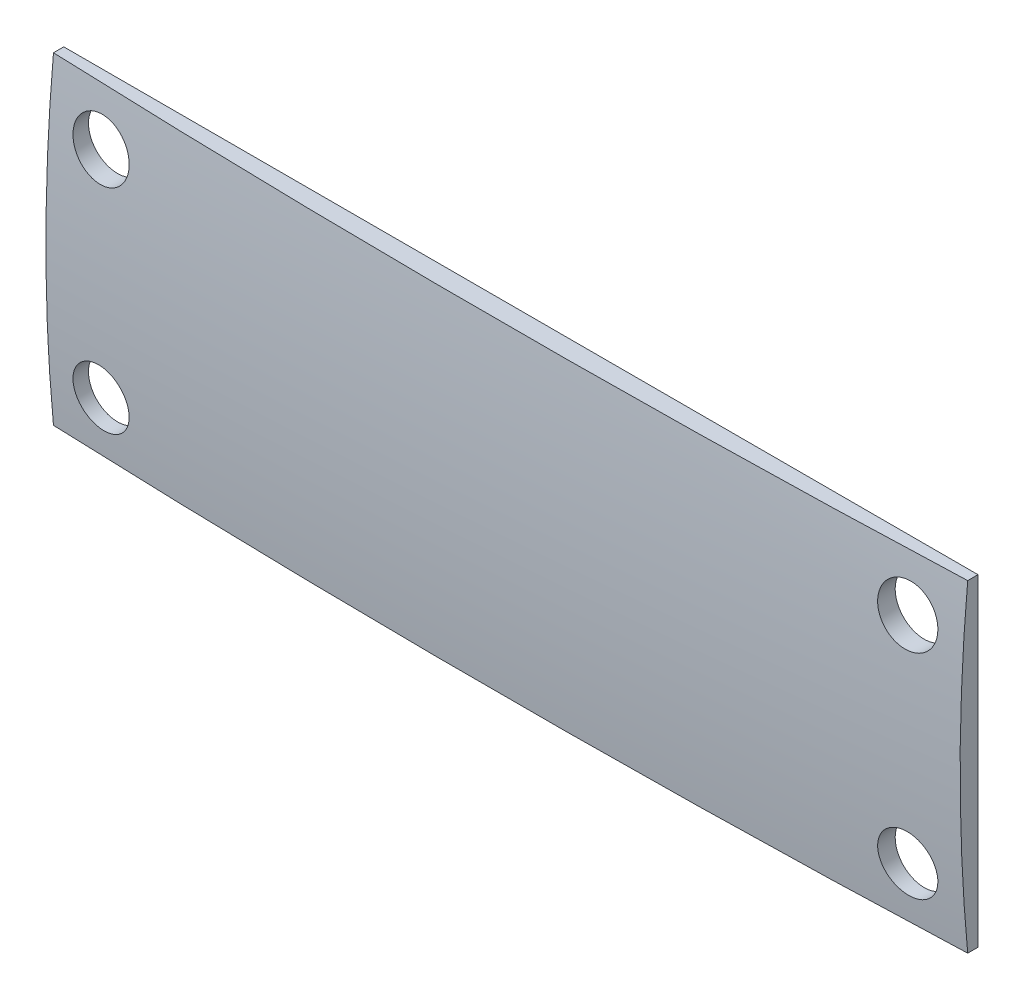
ISO-10303-21;
HEADER;
FILE_DESCRIPTION(('STEP AP214'),'2;1');
FILE_NAME('part.step','',(''),(''),'','','');
FILE_SCHEMA(('AUTOMOTIVE_DESIGN { 1 0 10303 214 1 1 1 1 }'));
ENDSEC;
DATA;
#1=APPLICATION_CONTEXT('core data for automotive mechanical design processes');
#2=APPLICATION_PROTOCOL_DEFINITION('international standard','automotive_design',2000,#1);
#3=PRODUCT_CONTEXT('',#1,'mechanical');
#4=PRODUCT('Part','Part','',(#3));
#5=PRODUCT_RELATED_PRODUCT_CATEGORY('part','',(#4));
#6=PRODUCT_DEFINITION_FORMATION('','',#4);
#7=PRODUCT_DEFINITION_CONTEXT('part definition',#1,'design');
#8=PRODUCT_DEFINITION('design','',#6,#7);
#9=PRODUCT_DEFINITION_SHAPE('','',#8);
#10=(LENGTH_UNIT() NAMED_UNIT(*) SI_UNIT(.MILLI.,.METRE.));
#11=(NAMED_UNIT(*) PLANE_ANGLE_UNIT() SI_UNIT($,.RADIAN.));
#12=(NAMED_UNIT(*) SI_UNIT($,.STERADIAN.) SOLID_ANGLE_UNIT());
#13=UNCERTAINTY_MEASURE_WITH_UNIT(LENGTH_MEASURE(1.E-05),#10,'distance_accuracy_value','');
#14=(GEOMETRIC_REPRESENTATION_CONTEXT(3) GLOBAL_UNCERTAINTY_ASSIGNED_CONTEXT((#13)) GLOBAL_UNIT_ASSIGNED_CONTEXT((#10,
#11,#12)) REPRESENTATION_CONTEXT('',''));
#15=CARTESIAN_POINT('',(0.,0.,0.));
#16=DIRECTION('',(0.,0.,1.));
#17=DIRECTION('',(1.,0.,0.));
#18=AXIS2_PLACEMENT_3D('',#15,#16,#17);
#19=CARTESIAN_POINT('',(53.975,19.05,-2745.74));
#20=DIRECTION('',(1.,0.,0.));
#21=DIRECTION('',(0.,0.,-1.));
#22=AXIS2_PLACEMENT_3D('',#19,#20,#21);
#23=PLANE('',#22);
#24=DIRECTION('',(0.,0.,1.));
#25=VECTOR('',#24,1.);
#26=CARTESIAN_POINT('',(53.975,-19.05,-2745.74));
#27=LINE('',#26,#25);
#28=CARTESIAN_POINT('',(53.975,-19.05,-3.175));
#29=VERTEX_POINT('',#28);
#30=CARTESIAN_POINT('',(53.975,-19.05,-1.95920329500043));
#31=VERTEX_POINT('',#30);
#32=EDGE_CURVE('E96',#29,#31,#27,.T.);
#33=ORIENTED_EDGE('',*,*,#32,.F.);
#34=DIRECTION('',(0.,1.,0.));
#35=VECTOR('',#34,1.);
#36=CARTESIAN_POINT('',(53.975,22.3762154077602,-3.175));
#37=LINE('',#36,#35);
#38=CARTESIAN_POINT('',(53.975,19.05,-3.175));
#39=VERTEX_POINT('',#38);
#40=EDGE_CURVE('E80',#29,#39,#37,.T.);
#41=ORIENTED_EDGE('',*,*,#40,.T.);
#42=DIRECTION('',(0.,0.,1.));
#43=VECTOR('',#42,1.);
#44=CARTESIAN_POINT('',(53.975,19.05,-2745.74));
#45=LINE('',#44,#43);
#46=CARTESIAN_POINT('',(53.975,19.05,-1.95920329500043));
#47=VERTEX_POINT('',#46);
#48=EDGE_CURVE('E84',#39,#47,#45,.T.);
#49=ORIENTED_EDGE('',*,*,#48,.T.);
#50=CARTESIAN_POINT('',(53.9749999999998,19.05,-1.95920329500056));
#51=CARTESIAN_POINT('',(53.9749999999999,17.9924033348274,-1.8594856106786));
#52=CARTESIAN_POINT('',(53.975,16.9340283265598,-1.76801425342624));
#53=CARTESIAN_POINT('',(53.975,14.8172760570648,-1.60173450307606));
#54=CARTESIAN_POINT('',(53.975,13.7589003898154,-1.52690581615503));
#55=CARTESIAN_POINT('',(53.975,11.6421470904961,-1.39390225706191));
#56=CARTESIAN_POINT('',(53.975,10.5837704825943,-1.33571109014283));
#57=CARTESIAN_POINT('',(53.975,8.46701633278184,-1.23597144435434));
#58=CARTESIAN_POINT('',(53.975,7.40863936838826,-1.19441071075106));
#59=CARTESIAN_POINT('',(53.975,5.29188507272644,-1.12792356554718));
#60=CARTESIAN_POINT('',(53.975,4.23350799868107,-1.1029889664348));
#61=CARTESIAN_POINT('',(53.975,2.11675390681585,-1.06974723204027));
#62=CARTESIAN_POINT('',(53.975,1.05837695340797,-1.06143599589672));
#63=CARTESIAN_POINT('',(53.975,-1.05837695340781,-1.06143599589672));
#64=CARTESIAN_POINT('',(53.975,-2.11675390681569,-1.06974723204027));
#65=CARTESIAN_POINT('',(53.975,-4.23350799868091,-1.10298896643479));
#66=CARTESIAN_POINT('',(53.975,-5.29188507272628,-1.12792356554715));
#67=CARTESIAN_POINT('',(53.975,-7.4086393683881,-1.19441071075107));
#68=CARTESIAN_POINT('',(53.975,-8.46701633278168,-1.23597144435441));
#69=CARTESIAN_POINT('',(53.975,-10.5837704825942,-1.33571109014279));
#70=CARTESIAN_POINT('',(53.975,-11.642147090496,-1.3939022570617));
#71=CARTESIAN_POINT('',(53.975,-13.7589003898153,-1.52690581615482));
#72=CARTESIAN_POINT('',(53.975,-14.8172760570647,-1.60173450307599));
#73=CARTESIAN_POINT('',(53.9749999999999,-16.9340283265597,-1.76801425342634));
#74=CARTESIAN_POINT('',(53.9749999999998,-17.9924033348272,-1.85948561067874));
#75=CARTESIAN_POINT('',(53.9749999999995,-19.0499999999998,-1.95920329500047));
#76=B_SPLINE_CURVE_WITH_KNOTS('',3,(#50,#51,#52,#53,#54,#55,#56,#57,#58,#59,#60,#61,#62,#63,#64,
#65,#66,#67,#68,#69,#70,#71,#72,#73,#74,#75),.UNSPECIFIED.,.F.,.F.,(4,2,2,2,2,2,2,2,2,2,2,2,4),
(0.,3.18683083113672,6.36975411961527,9.54954929769601,12.7269969949887,15.9028788056506,
19.0779770529453,22.25307530024,25.428957110902,28.6064048081946,31.7861999862754,
34.9691232747539,38.1559541058906),.UNSPECIFIED.);
#77=EDGE_CURVE('E45',#47,#31,#76,.T.);
#78=ORIENTED_EDGE('',*,*,#77,.T.);
#79=EDGE_LOOP('',(#33,#41,#49,#78));
#80=FACE_BOUND('',#79,.T.);
#81=ADVANCED_FACE('F34',(#80),#23,.T.);
#82=CARTESIAN_POINT('',(-53.975,-19.05,-2745.74));
#83=DIRECTION('',(0.,-1.,0.));
#84=DIRECTION('',(0.,0.,-1.));
#85=AXIS2_PLACEMENT_3D('',#82,#83,#84);
#86=PLANE('',#85);
#87=DIRECTION('',(0.,0.,1.));
#88=VECTOR('',#87,1.);
#89=CARTESIAN_POINT('',(-53.975,-19.05,-2745.74));
#90=LINE('',#89,#88);
#91=CARTESIAN_POINT('',(-53.975,-19.05,-3.175));
#92=VERTEX_POINT('',#91);
#93=CARTESIAN_POINT('',(-53.975,-19.05,-1.95920329500066));
#94=VERTEX_POINT('',#93);
#95=EDGE_CURVE('E88',#92,#94,#90,.T.);
#96=ORIENTED_EDGE('',*,*,#95,.F.);
#97=DIRECTION('',(1.,0.,0.));
#98=VECTOR('',#97,1.);
#99=CARTESIAN_POINT('',(-53.975,-19.05,-3.17500000000015));
#100=LINE('',#99,#98);
#101=EDGE_CURVE('E77',#92,#29,#100,.T.);
#102=ORIENTED_EDGE('',*,*,#101,.T.);
#103=ORIENTED_EDGE('',*,*,#32,.T.);
#104=CARTESIAN_POINT('',(0.,-19.05,-1372.87));
#105=DIRECTION('',(0.,-1.,0.));
#106=DIRECTION('',(0.,0.,-1.));
#107=AXIS2_PLACEMENT_3D('',#104,#105,#106);
#108=CIRCLE('',#107,1371.97292726472);
#109=EDGE_CURVE('E94',#31,#94,#108,.T.);
#110=ORIENTED_EDGE('',*,*,#109,.T.);
#111=EDGE_LOOP('',(#96,#102,#103,#110));
#112=FACE_BOUND('',#111,.T.);
#113=ADVANCED_FACE('F92',(#112),#86,.T.);
#114=CARTESIAN_POINT('',(-53.975,19.05,-2745.74));
#115=DIRECTION('',(-1.,0.,0.));
#116=DIRECTION('',(0.,0.,1.));
#117=AXIS2_PLACEMENT_3D('',#114,#115,#116);
#118=PLANE('',#117);
#119=DIRECTION('',(0.,0.,1.));
#120=VECTOR('',#119,1.);
#121=CARTESIAN_POINT('',(-53.975,19.05,-2745.74));
#122=LINE('',#121,#120);
#123=CARTESIAN_POINT('',(-53.975,19.05,-3.17500000000015));
#124=VERTEX_POINT('',#123);
#125=CARTESIAN_POINT('',(-53.975,19.05,-1.95920329500043));
#126=VERTEX_POINT('',#125);
#127=EDGE_CURVE('E59',#124,#126,#122,.T.);
#128=ORIENTED_EDGE('',*,*,#127,.F.);
#129=DIRECTION('',(0.,-1.,0.));
#130=VECTOR('',#129,1.);
#131=CARTESIAN_POINT('',(-53.975,22.3762154077602,-3.175));
#132=LINE('',#131,#130);
#133=EDGE_CURVE('E53',#124,#92,#132,.T.);
#134=ORIENTED_EDGE('',*,*,#133,.T.);
#135=ORIENTED_EDGE('',*,*,#95,.T.);
#136=CARTESIAN_POINT('',(-53.975,-19.0499999999999,-1.95920329500056));
#137=CARTESIAN_POINT('',(-53.975,-17.9924033348273,-1.85948561067876));
#138=CARTESIAN_POINT('',(-53.975,-16.9340283265597,-1.76801425342634));
#139=CARTESIAN_POINT('',(-53.975,-14.8172760570647,-1.60173450307597));
#140=CARTESIAN_POINT('',(-53.975,-13.7589003898153,-1.52690581615481));
#141=CARTESIAN_POINT('',(-53.975,-11.642147090496,-1.3939022570617));
#142=CARTESIAN_POINT('',(-53.975,-10.5837704825943,-1.33571109014279));
#143=CARTESIAN_POINT('',(-53.975,-8.46701633278176,-1.2359714443544));
#144=CARTESIAN_POINT('',(-53.975,-7.40863936838817,-1.19441071075106));
#145=CARTESIAN_POINT('',(-53.975,-5.29188507272635,-1.12792356554715));
#146=CARTESIAN_POINT('',(-53.975,-4.23350799868098,-1.10298896643479));
#147=CARTESIAN_POINT('',(-53.975,-2.11675390681576,-1.06974723204027));
#148=CARTESIAN_POINT('',(-53.975,-1.05837695340787,-1.06143599589672));
#149=CARTESIAN_POINT('',(-53.975,1.05837695340791,-1.06143599589672));
#150=CARTESIAN_POINT('',(-53.975,2.11675390681579,-1.06974723204027));
#151=CARTESIAN_POINT('',(-53.975,4.23350799868101,-1.1029889664348));
#152=CARTESIAN_POINT('',(-53.975,5.29188507272639,-1.12792356554717));
#153=CARTESIAN_POINT('',(-53.975,7.40863936838821,-1.19441071075106));
#154=CARTESIAN_POINT('',(-53.975,8.46701633278179,-1.23597144435436));
#155=CARTESIAN_POINT('',(-53.975,10.5837704825943,-1.33571109014285));
#156=CARTESIAN_POINT('',(-53.975,11.6421470904961,-1.39390225706191));
#157=CARTESIAN_POINT('',(-53.975,13.7589003898154,-1.52690581615502));
#158=CARTESIAN_POINT('',(-53.975,14.8172760570648,-1.60173450307605));
#159=CARTESIAN_POINT('',(-53.975,16.9340283265598,-1.76801425342622));
#160=CARTESIAN_POINT('',(-53.975,17.9924033348274,-1.85948561067856));
#161=CARTESIAN_POINT('',(-53.975,19.0499999999999,-1.95920329500047));
#162=B_SPLINE_CURVE_WITH_KNOTS('',3,(#136,#137,#138,#139,#140,#141,#142,#143,#144,#145,#146,
#147,#148,#149,#150,#151,#152,#153,#154,#155,#156,#157,#158,#159,#160,#161),.UNSPECIFIED.,.F.,
.F.,(4,2,2,2,2,2,2,2,2,2,2,2,4),(0.,3.18683083113672,6.36975411961529,9.54954929769603,
12.7269969949887,15.9028788056507,19.0779770529454,22.25307530024,25.428957110902,
28.6064048081947,31.7861999862754,34.969123274754,38.1559541058907),.UNSPECIFIED.);
#163=EDGE_CURVE('E105',#94,#126,#162,.T.);
#164=ORIENTED_EDGE('',*,*,#163,.T.);
#165=EDGE_LOOP('',(#128,#134,#135,#164));
#166=FACE_BOUND('',#165,.T.);
#167=ADVANCED_FACE('F87',(#166),#118,.T.);
#168=CARTESIAN_POINT('',(-53.975,19.05,-2745.74));
#169=DIRECTION('',(0.,1.,0.));
#170=DIRECTION('',(0.,0.,1.));
#171=AXIS2_PLACEMENT_3D('',#168,#169,#170);
#172=PLANE('',#171);
#173=ORIENTED_EDGE('',*,*,#48,.F.);
#174=DIRECTION('',(-1.,0.,0.));
#175=VECTOR('',#174,1.);
#176=CARTESIAN_POINT('',(-53.975,19.05,-3.17500000000015));
#177=LINE('',#176,#175);
#178=EDGE_CURVE('E12',#39,#124,#177,.T.);
#179=ORIENTED_EDGE('',*,*,#178,.T.);
#180=ORIENTED_EDGE('',*,*,#127,.T.);
#181=CARTESIAN_POINT('',(0.,19.05,-1372.87));
#182=DIRECTION('',(0.,-1.,0.));
#183=DIRECTION('',(0.,0.,-1.));
#184=AXIS2_PLACEMENT_3D('',#181,#182,#183);
#185=CIRCLE('',#184,1371.97292726472);
#186=EDGE_CURVE('E98',#126,#47,#185,.F.);
#187=ORIENTED_EDGE('',*,*,#186,.T.);
#188=EDGE_LOOP('',(#173,#179,#180,#187));
#189=FACE_BOUND('',#188,.T.);
#190=ADVANCED_FACE('F117',(#189),#172,.T.);
#191=CARTESIAN_POINT('',(0.,1.95086345019787E-13,-1372.87));
#192=DIRECTION('',(1.,0.,0.));
#193=DIRECTION('',(0.,0.,1.));
#194=AXIS2_PLACEMENT_3D('',#191,#192,#193);
#195=ELLIPSE('',#194,1372.87,527.05);
#196=TRIMMED_CURVE('',#195,(PARAMETER_VALUE(4.71238898038469)),
(PARAMETER_VALUE(7.85398163397448)),.T.,.PARAMETER.);
#197=CARTESIAN_POINT('',(0.,-527.05,-1372.87));
#198=DIRECTION('',(0.,-1.,0.));
#199=AXIS1_PLACEMENT('',#197,#198);
#200=SURFACE_OF_REVOLUTION('',#196,#199);
#201=CARTESIAN_POINT('',(-51.054,-12.6999999999999,-1.34852372931991));
#202=CARTESIAN_POINT('',(-51.0539914256195,-12.5069583414921,-1.33639526311172));
#203=CARTESIAN_POINT('',(-51.0376441534456,-12.3137964700659,-1.32392969212028));
#204=CARTESIAN_POINT('',(-50.9726742623735,-11.9328349545905,-1.2986652675942));
#205=CARTESIAN_POINT('',(-50.9240123789474,-11.7450421242065,-1.28586602682669));
#206=CARTESIAN_POINT('',(-50.7958050544153,-11.3803971699149,-1.26025473595436));
#207=CARTESIAN_POINT('',(-50.7162747523711,-11.2035397320855,-1.24744269519464));
#208=CARTESIAN_POINT('',(-50.528606605591,-10.8657604160385,-1.22207857056183));
#209=CARTESIAN_POINT('',(-50.4204759834359,-10.7048345286283,-1.20952642191862));
#210=CARTESIAN_POINT('',(-50.1786431544214,-10.4034189214012,-1.18492222261351));
#211=CARTESIAN_POINT('',(-50.044937132299,-10.2629322561594,-1.17287024689278));
#212=CARTESIAN_POINT('',(-49.7557485899998,-10.0064319687207,-1.14949135253923));
#213=CARTESIAN_POINT('',(-49.6002652541209,-9.890419263641,-1.13816446108869));
#214=CARTESIAN_POINT('',(-49.272079323622,-9.68628409385795,-1.11645339063856));
#215=CARTESIAN_POINT('',(-49.0993913063042,-9.59813827779926,-1.10606842757226));
#216=CARTESIAN_POINT('',(-48.7415918638466,-9.452139664346,-1.08642988631453));
#217=CARTESIAN_POINT('',(-48.5564805431451,-9.3942866123272,-1.07717629861388));
#218=CARTESIAN_POINT('',(-48.1793662207213,-9.31060894741609,-1.06000892606623));
#219=CARTESIAN_POINT('',(-47.987373182274,-9.28473981411479,-1.05209329212676));
#220=CARTESIAN_POINT('',(-47.6017143356272,-9.26564825124079,-1.0377810400601));
#221=CARTESIAN_POINT('',(-47.4080485446906,-9.27242548515665,-1.03138440627612));
#222=CARTESIAN_POINT('',(-47.0248861489523,-9.31842123507302,-1.02031136973446));
#223=CARTESIAN_POINT('',(-46.8353831307718,-9.35758563860736,-1.01563211639372));
#224=CARTESIAN_POINT('',(-46.4656101070955,-9.46719294754072,-1.00816049199849));
#225=CARTESIAN_POINT('',(-46.2853400241729,-9.53763559059424,-1.00536810511845));
#226=CARTESIAN_POINT('',(-45.9394480329413,-9.70767052653722,-1.00183430141488));
#227=CARTESIAN_POINT('',(-45.7738034642329,-9.80721665741293,-1.00108965591636));
#228=CARTESIAN_POINT('',(-45.4615560023601,-10.0326731469582,-1.00176843327446));
#229=CARTESIAN_POINT('',(-45.314952959163,-10.1585832978792,-1.00319183904737));
#230=CARTESIAN_POINT('',(-45.0450788393149,-10.4330515933519,-1.00828073929791));
#231=CARTESIAN_POINT('',(-44.9217862733432,-10.5815886483433,-1.01194415544364));
#232=CARTESIAN_POINT('',(-44.7018483743063,-10.8971644935936,-1.02152219874353));
#233=CARTESIAN_POINT('',(-44.6052030185147,-11.0642032680731,-1.02743682397771));
#234=CARTESIAN_POINT('',(-44.4412390530316,-11.4120947919298,-1.04145254312957));
#235=CARTESIAN_POINT('',(-44.3739317418318,-11.5929528318416,-1.04955447746889));
#236=CARTESIAN_POINT('',(-44.270561579903,-11.963288636405,-1.06778884141748));
#237=CARTESIAN_POINT('',(-44.2344990025966,-12.1527664764731,-1.07792128879482));
#238=CARTESIAN_POINT('',(-44.1945477416304,-12.5353621670769,-1.09999305635925));
#239=CARTESIAN_POINT('',(-44.1907232316773,-12.7284865113149,-1.11193593236269));
#240=CARTESIAN_POINT('',(-44.215472982554,-13.1125506095234,-1.13727855968163));
#241=CARTESIAN_POINT('',(-44.2440477829416,-13.3034903270589,-1.15067833525605));
#242=CARTESIAN_POINT('',(-44.3328809500352,-13.6783706614416,-1.17856254505023));
#243=CARTESIAN_POINT('',(-44.3932330060058,-13.8622888476972,-1.19305007744089));
#244=CARTESIAN_POINT('',(-44.5439432387531,-14.217341767763,-1.22259414565668));
#245=CARTESIAN_POINT('',(-44.634301891724,-14.3884762986483,-1.23765069050848));
#246=CARTESIAN_POINT('',(-44.8427161315602,-14.7135290096139,-1.26784558757211));
#247=CARTESIAN_POINT('',(-44.9608369945054,-14.8674053318915,-1.28298404915021));
#248=CARTESIAN_POINT('',(-45.2213220108912,-15.1531088876971,-1.31276229216788));
#249=CARTESIAN_POINT('',(-45.3636862910754,-15.2849360059455,-1.32740207099989));
#250=CARTESIAN_POINT('',(-45.6686710835796,-15.5228042509417,-1.35564985113703));
#251=CARTESIAN_POINT('',(-45.8312953722145,-15.6288405595674,-1.36925765932781));
#252=CARTESIAN_POINT('',(-46.1721785114313,-15.8120395233231,-1.39493912545389));
#253=CARTESIAN_POINT('',(-46.3504371747818,-15.8892025241708,-1.40701280175714));
#254=CARTESIAN_POINT('',(-46.7170878358495,-16.0122563220818,-1.4291640447967));
#255=CARTESIAN_POINT('',(-46.9054548867127,-16.0582206026082,-1.4392462620592));
#256=CARTESIAN_POINT('',(-47.2873445138688,-16.1178026332334,-1.45710322276113));
#257=CARTESIAN_POINT('',(-47.4808669952265,-16.1314209785539,-1.46487800865901));
#258=CARTESIAN_POINT('',(-47.8668399008788,-16.1258829980867,-1.47785375247128));
#259=CARTESIAN_POINT('',(-48.0592916913805,-16.1068429294476,-1.4830637555583));
#260=CARTESIAN_POINT('',(-48.4383211633162,-16.0367189012797,-1.49082300268579));
#261=CARTESIAN_POINT('',(-48.6248989298762,-15.9856354063472,-1.4933722853025));
#262=CARTESIAN_POINT('',(-48.9863812118843,-15.8530383957957,-1.49579348254095));
#263=CARTESIAN_POINT('',(-49.1613144424356,-15.7716032714208,-1.49567224802603));
#264=CARTESIAN_POINT('',(-49.4950538448851,-15.5806080060186,-1.49286341248769));
#265=CARTESIAN_POINT('',(-49.6538607165627,-15.4710490861099,-1.49017592287577));
#266=CARTESIAN_POINT('',(-49.9508056132092,-15.2269736732978,-1.48242445510444));
#267=CARTESIAN_POINT('',(-50.0889509706271,-15.0924660724355,-1.47736132267526));
#268=CARTESIAN_POINT('',(-50.3407865488154,-14.8022511855676,-1.465120407982));
#269=CARTESIAN_POINT('',(-50.4544704914615,-14.6465384738862,-1.45794208396259));
#270=CARTESIAN_POINT('',(-50.6543894215619,-14.3179986342238,-1.44177124184082));
#271=CARTESIAN_POINT('',(-50.7405600582164,-14.1451326053145,-1.43277454979533));
#272=CARTESIAN_POINT('',(-50.8826138719608,-13.7876165333009,-1.41333487589191));
#273=CARTESIAN_POINT('',(-50.9385328139026,-13.6029806950567,-1.40289362028737));
#274=CARTESIAN_POINT('',(-51.0036565357482,-13.2976518596766,-1.38504962038776));
#275=CARTESIAN_POINT('',(-51.0225133817621,-13.1789114649602,-1.3779735979072));
#276=CARTESIAN_POINT('',(-51.0476877891476,-12.9401295549559,-1.36348311218256));
#277=CARTESIAN_POINT('',(-51.0540053339809,-12.820088037952,-1.35606864849213));
#278=CARTESIAN_POINT('',(-51.054,-12.6999999999999,-1.34852372931991));
#279=B_SPLINE_CURVE_WITH_KNOTS('',3,(#201,#202,#203,#204,#205,#206,#207,#208,#209,#210,#211,
#212,#213,#214,#215,#216,#217,#218,#219,#220,#221,#222,#223,#224,#225,#226,#227,#228,#229,#230,
#231,#232,#233,#234,#235,#236,#237,#238,#239,#240,#241,#242,#243,#244,#245,#246,#247,#248,#249,
#250,#251,#252,#253,#254,#255,#256,#257,#258,#259,#260,#261,#262,#263,#264,#265,#266,#267,#268,
#269,#270,#271,#272,#273,#274,#275,#276,#277,#278),.UNSPECIFIED.,.T.,.F.,(4,2,2,2,2,2,2,2,2,2,2,
2,2,2,2,2,2,2,2,2,2,2,2,2,2,2,2,2,2,2,2,2,2,2,2,2,2,2,4),(0.,0.579827440053274,1.16036070354615,
1.7406096101911,2.32071212337365,2.90090124212989,3.48111209855843,4.0608354644878,
4.64055395750463,5.21946459241614,5.79836926005905,6.37630864368795,6.95424317995506,
7.53126596262473,8.1082841985214,8.68476787461509,9.2612510590498,9.83795605949621,
10.4146661066362,10.9925238932672,11.5703913033217,12.1499720663739,12.7295620276078,
13.310528632777,13.8914982753061,14.4725763687274,15.0536475043247,15.6333452284306,
16.2130322850047,16.7906600565906,17.3682794533691,17.9444172159085,18.5205299671136,
19.0964377772757,19.6724932207427,20.2498862933227,20.8265952469446,21.1872958766922,
21.547996982169),.UNSPECIFIED.);
#280=CARTESIAN_POINT('',(-51.054,-12.6999999999999,-1.34852372931991));
#281=VERTEX_POINT('',#280);
#282=EDGE_CURVE('E90',#281,#281,#279,.T.);
#283=ORIENTED_EDGE('',*,*,#282,.T.);
#284=EDGE_LOOP('',(#283));
#285=FACE_BOUND('',#284,.T.);
#286=CARTESIAN_POINT('',(-51.054,12.7,-1.34852372931991));
#287=CARTESIAN_POINT('',(-51.053991569302,12.8926700762648,-1.3606289310947));
#288=CARTESIAN_POINT('',(-51.0377075249898,13.085498761551,-1.37241581740714));
#289=CARTESIAN_POINT('',(-50.9729471773638,13.465896974362,-1.39499067186821));
#290=CARTESIAN_POINT('',(-50.924432699387,13.6534599901736,-1.40577743816006));
#291=CARTESIAN_POINT('',(-50.7965526110264,14.0177760457446,-1.42597243178258));
#292=CARTESIAN_POINT('',(-50.7171988198398,14.1945331968636,-1.43538118533821));
#293=CARTESIAN_POINT('',(-50.5298809365975,14.5322067080084,-1.45246239717786));
#294=CARTESIAN_POINT('',(-50.4219240509865,14.6931270440758,-1.46013529190369));
#295=CARTESIAN_POINT('',(-50.1806321598055,14.9943321234664,-1.47340556394533));
#296=CARTESIAN_POINT('',(-50.0473383761495,15.1346497381144,-1.47900626959606));
#297=CARTESIAN_POINT('',(-49.7590288230021,15.3909411494313,-1.487868494928));
#298=CARTESIAN_POINT('',(-49.6040125378912,15.5069143680823,-1.49112995907218));
#299=CARTESIAN_POINT('',(-49.2770967144437,15.7109211262363,-1.49509898003555));
#300=CARTESIAN_POINT('',(-49.1052413983576,15.7990254083919,-1.49581305135994));
#301=CARTESIAN_POINT('',(-48.749206148902,15.9451858880259,-1.49458839876974));
#302=CARTESIAN_POINT('',(-48.5650263742487,16.0032424723786,-1.49264970901152));
#303=CARTESIAN_POINT('',(-48.1898342048583,16.0876138777754,-1.48611220852086));
#304=CARTESIAN_POINT('',(-47.998831014329,16.1139699105247,-1.48151686306311));
#305=CARTESIAN_POINT('',(-47.6151869991566,16.1343623598795,-1.46976977789727));
#306=CARTESIAN_POINT('',(-47.4225461734112,16.1283987547292,-1.46261803646838));
#307=CARTESIAN_POINT('',(-47.0408774760728,16.0843438416667,-1.44596276322697));
#308=CARTESIAN_POINT('',(-46.8518535465806,16.0462193173397,-1.43645680710969));
#309=CARTESIAN_POINT('',(-46.4829502247971,15.9389296867398,-1.41541495742579));
#310=CARTESIAN_POINT('',(-46.3030709860723,15.8697640593867,-1.40387902978446));
#311=CARTESIAN_POINT('',(-45.9569631559105,15.7021293710612,-1.37914573784581));
#312=CARTESIAN_POINT('',(-45.7907784481666,15.6035704508748,-1.36594335139707));
#313=CARTESIAN_POINT('',(-45.4773409902687,15.3800476586946,-1.33838382242843));
#314=CARTESIAN_POINT('',(-45.3300886147598,15.2550832643018,-1.32402665706615));
#315=CARTESIAN_POINT('',(-45.0581705755294,14.9818207787585,-1.29462906092198));
#316=CARTESIAN_POINT('',(-44.9335835222763,14.8334446895313,-1.27958647019117));
#317=CARTESIAN_POINT('',(-44.7111248650889,14.5178677427312,-1.24940677823564));
#318=CARTESIAN_POINT('',(-44.6132535926317,14.3506666516228,-1.23426967584065));
#319=CARTESIAN_POINT('',(-44.446858949985,14.0018674066599,-1.20440805283246));
#320=CARTESIAN_POINT('',(-44.3783847502441,13.8202457289514,-1.18968426167545));
#321=CARTESIAN_POINT('',(-44.2729911448722,13.4479951341205,-1.16117361540121));
#322=CARTESIAN_POINT('',(-44.2360716566116,13.2573662405859,-1.14738675783061));
#323=CARTESIAN_POINT('',(-44.1948988232249,12.8727025492949,-1.1212012510076));
#324=CARTESIAN_POINT('',(-44.1906142662478,12.6786711837443,-1.10880128652812));
#325=CARTESIAN_POINT('',(-44.2148026326279,12.2925559488217,-1.08573555915554));
#326=CARTESIAN_POINT('',(-44.2432750942608,12.1004720520377,-1.07506977182088));
#327=CARTESIAN_POINT('',(-44.332091371904,11.7242719467836,-1.05577190133832));
#328=CARTESIAN_POINT('',(-44.3923473770067,11.5401352907331,-1.04713430928673));
#329=CARTESIAN_POINT('',(-44.5430027308555,11.1845402915978,-1.03203385027641));
#330=CARTESIAN_POINT('',(-44.6334015933159,11.0130817440355,-1.02557094823743));
#331=CARTESIAN_POINT('',(-44.8414968430529,10.68822034755,-1.01492313742391));
#332=CARTESIAN_POINT('',(-44.9591160422304,10.5347682584366,-1.01073189720408));
#333=CARTESIAN_POINT('',(-45.2184595380516,10.2497496967206,-1.00460584544081));
#334=CARTESIAN_POINT('',(-45.3601836086834,10.1181830189389,-1.0026710127422));
#335=CARTESIAN_POINT('',(-45.6634767309043,9.88087103084212,-1.00099613759867));
#336=CARTESIAN_POINT('',(-45.825015518666,9.77508706189953,-1.00125278815724));
#337=CARTESIAN_POINT('',(-46.1635196116334,9.59208516799888,-1.00383691914748));
#338=CARTESIAN_POINT('',(-46.3404848809412,9.51486717656924,-1.00616439476041));
#339=CARTESIAN_POINT('',(-46.7048328217734,9.39117101507874,-1.01273682551155));
#340=CARTESIAN_POINT('',(-46.892216365115,9.34469542179934,-1.01698194133331));
#341=CARTESIAN_POINT('',(-47.2720743468604,9.28379076355737,-1.02721296025581));
#342=CARTESIAN_POINT('',(-47.4645488196851,9.26936191532575,-1.03319887512921));
#343=CARTESIAN_POINT('',(-47.8493713728564,9.27293597234807,-1.04673135345455));
#344=CARTESIAN_POINT('',(-48.0417190268805,9.29097767767811,-1.05427977445402));
#345=CARTESIAN_POINT('',(-48.4206133543289,9.35902867806652,-1.07073999793194));
#346=CARTESIAN_POINT('',(-48.6071599695993,9.40903829348599,-1.07965181407274));
#347=CARTESIAN_POINT('',(-48.9694864761336,9.53969203157138,-1.09866093986969));
#348=CARTESIAN_POINT('',(-49.1452478756006,9.62038715060658,-1.10876020354357));
#349=CARTESIAN_POINT('',(-49.4806890326993,9.81008908353021,-1.12993514160521));
#350=CARTESIAN_POINT('',(-49.6403692823825,9.91909503079781,-1.14101078609821));
#351=CARTESIAN_POINT('',(-49.939376371363,10.1624966863431,-1.16395279798917));
#352=CARTESIAN_POINT('',(-50.0786721020393,10.2969304977068,-1.17582033452073));
#353=CARTESIAN_POINT('',(-50.3327184017077,10.5872958069571,-1.2001170700823));
#354=CARTESIAN_POINT('',(-50.447462712305,10.743232769586,-1.21254641134609));
#355=CARTESIAN_POINT('',(-50.6492933951542,11.0724113345882,-1.2377458129696));
#356=CARTESIAN_POINT('',(-50.7363315685827,11.2456824115701,-1.25051642564969));
#357=CARTESIAN_POINT('',(-50.8799343390266,11.6042543460021,-1.27610197727563));
#358=CARTESIAN_POINT('',(-50.9365350697387,11.7895406453592,-1.28891684540506));
#359=CARTESIAN_POINT('',(-51.0026854756891,12.0966605969077,-1.30957343563609));
#360=CARTESIAN_POINT('',(-51.0219031726173,12.216492917766,-1.3174939372189));
#361=CARTESIAN_POINT('',(-51.0475630920822,12.4575292143729,-1.33315956885799));
#362=CARTESIAN_POINT('',(-51.0540053062928,12.5787331910156,-1.34090469879997));
#363=CARTESIAN_POINT('',(-51.054,12.7,-1.34852372931991));
#364=B_SPLINE_CURVE_WITH_KNOTS('',3,(#286,#287,#288,#289,#290,#291,#292,#293,#294,#295,#296,
#297,#298,#299,#300,#301,#302,#303,#304,#305,#306,#307,#308,#309,#310,#311,#312,#313,#314,#315,
#316,#317,#318,#319,#320,#321,#322,#323,#324,#325,#326,#327,#328,#329,#330,#331,#332,#333,#334,
#335,#336,#337,#338,#339,#340,#341,#342,#343,#344,#345,#346,#347,#348,#349,#350,#351,#352,#353,
#354,#355,#356,#357,#358,#359,#360,#361,#362,#363),.UNSPECIFIED.,.T.,.F.,(4,2,2,2,2,2,2,2,2,2,2,
2,2,2,2,2,2,2,2,2,2,2,2,2,2,2,2,2,2,2,2,2,2,2,2,2,2,2,4),(0.,0.578707600700717,1.15810186446452,
1.73727429343804,2.31630094057309,2.89439347981379,3.47249974336314,4.04912653865532,
4.62574590949681,5.20161484413039,5.77748416640412,6.35394898679773,6.93042348454185,
7.50867872958882,8.08694541576107,8.66718098887982,9.24742376096487,9.82863331911383,
10.409841355297,10.9904934577486,11.5711373757581,12.15018544106,12.7292241652049,
13.3066406166376,13.8840516544002,14.4605915203505,15.0371300447133,15.6137168875446,
16.1903076297996,16.767587815805,17.3448737870187,17.9231233751165,18.501355264541,
19.0804605861816,19.6597133519708,20.2399683731219,20.8195330174149,21.1837721338136,
21.5480114875964),.UNSPECIFIED.);
#365=CARTESIAN_POINT('',(-51.054,12.7,-1.34852372931991));
#366=VERTEX_POINT('',#365);
#367=EDGE_CURVE('E138',#366,#366,#364,.T.);
#368=ORIENTED_EDGE('',*,*,#367,.T.);
#369=EDGE_LOOP('',(#368));
#370=FACE_BOUND('',#369,.T.);
#371=CARTESIAN_POINT('',(44.1960000000001,12.7,-1.11040576648217));
#372=CARTESIAN_POINT('',(44.1960086389857,12.8931363642965,-1.12253875761065));
#373=CARTESIAN_POINT('',(44.2123723686043,13.0863645854163,-1.13548333027807));
#374=CARTESIAN_POINT('',(44.2773755419366,13.4673926887887,-1.16260257306169));
#375=CARTESIAN_POINT('',(44.3260549566032,13.6551855475164,-1.17677874763735));
#376=CARTESIAN_POINT('',(44.4542639876855,14.0197630384555,-1.20588246400221));
#377=CARTESIAN_POINT('',(44.5337760235853,14.1965538773863,-1.22080957340083));
#378=CARTESIAN_POINT('',(44.7213628802478,14.5341824431118,-1.25090509889681));
#379=CARTESIAN_POINT('',(44.8294305473731,14.6950241515565,-1.26607345366522));
#380=CARTESIAN_POINT('',(45.0712528785679,14.9964763150054,-1.29613690963808));
#381=CARTESIAN_POINT('',(45.2050427827419,15.1370585463215,-1.31103160489264));
#382=CARTESIAN_POINT('',(45.4944428110799,15.3937291748033,-1.33998371841877));
#383=CARTESIAN_POINT('',(45.6500538148415,15.5098165841222,-1.35404110290619));
#384=CARTESIAN_POINT('',(45.9785830012597,15.7140904127467,-1.38079247414904));
#385=CARTESIAN_POINT('',(46.1514893926906,15.8022956724797,-1.39348737770781));
#386=CARTESIAN_POINT('',(46.5097959862966,15.9483515867382,-1.41706279787607));
#387=CARTESIAN_POINT('',(46.6951959753568,16.0062027588936,-1.42794334542371));
#388=CARTESIAN_POINT('',(47.0726477226834,16.0897196585074,-1.44747791118399));
#389=CARTESIAN_POINT('',(47.2646782642613,16.1154797495099,-1.45613839753325));
#390=CARTESIAN_POINT('',(47.6504309697658,16.1343386550144,-1.47099189378277));
#391=CARTESIAN_POINT('',(47.8441530958361,16.1274381985719,-1.47718495875799));
#392=CARTESIAN_POINT('',(48.2270738087573,16.0812144445047,-1.48691466964599));
#393=CARTESIAN_POINT('',(48.4162857640664,16.0420037818233,-1.49046046235225));
#394=CARTESIAN_POINT('',(48.7854832102525,15.9323982343996,-1.49487504461222));
#395=CARTESIAN_POINT('',(48.9654688128685,15.8620037274201,-1.49574386659389));
#396=CARTESIAN_POINT('',(49.3107461480558,15.6921970447767,-1.49486081932813));
#397=CARTESIAN_POINT('',(49.476065542349,15.5928410788978,-1.49311399972705));
#398=CARTESIAN_POINT('',(49.7877157598611,15.3678894179011,-1.48716386773599));
#399=CARTESIAN_POINT('',(49.93404658566,15.2422937263486,-1.48296055567978));
#400=CARTESIAN_POINT('',(50.2036602542932,14.9683700382846,-1.47233247978153));
#401=CARTESIAN_POINT('',(50.3269314641888,14.820030636491,-1.46590659934695));
#402=CARTESIAN_POINT('',(50.546877768671,14.5048813004098,-1.45113400968734));
#403=CARTESIAN_POINT('',(50.64355257088,14.3380711630993,-1.44278727934801));
#404=CARTESIAN_POINT('',(50.807797524886,13.9903108431776,-1.42449228747099));
#405=CARTESIAN_POINT('',(50.8753017190095,13.8093296977397,-1.4145404656544));
#406=CARTESIAN_POINT('',(50.9790165263143,13.4386812639484,-1.39340926275736));
#407=CARTESIAN_POINT('',(51.0152267102426,13.249013856485,-1.3822298648409));
#408=CARTESIAN_POINT('',(51.0554127514352,12.8658578590609,-1.35897380512934));
#409=CARTESIAN_POINT('',(51.0593063230937,12.6723607713756,-1.34689493182559));
#410=CARTESIAN_POINT('',(51.0345548007373,12.2874927555793,-1.32221227719006));
#411=CARTESIAN_POINT('',(51.0059093757693,12.0961218491137,-1.30960849052065));
#412=CARTESIAN_POINT('',(50.9168256336048,11.7205994013455,-1.28417618452139));
#413=CARTESIAN_POINT('',(50.8563335971804,11.5364606249794,-1.27134732098279));
#414=CARTESIAN_POINT('',(50.7052428593153,11.1809722027373,-1.24577875690518));
#415=CARTESIAN_POINT('',(50.6146440419407,11.0096226061124,-1.23303905670971));
#416=CARTESIAN_POINT('',(50.4058571399352,10.6845063602931,-1.2079056792613));
#417=CARTESIAN_POINT('',(50.2876563073809,10.5307478845518,-1.1955121648636));
#418=CARTESIAN_POINT('',(50.0270381887583,10.2452891332459,-1.17131397781455));
#419=CARTESIAN_POINT('',(49.8846209286873,10.1135888340013,-1.15950930453106));
#420=CARTESIAN_POINT('',(49.5796978546571,9.87608019603506,-1.13671204103341));
#421=CARTESIAN_POINT('',(49.4172035790907,9.77025708874912,-1.12571899012493));
#422=CARTESIAN_POINT('',(49.0766747336397,9.58744057752036,-1.10474139738062));
#423=CARTESIAN_POINT('',(48.8986402628202,9.51044698981263,-1.09475684911669));
#424=CARTESIAN_POINT('',(48.5323242502843,9.38758731892637,-1.07600596815267));
#425=CARTESIAN_POINT('',(48.3440558065203,9.34168241503268,-1.06723812706366));
#426=CARTESIAN_POINT('',(47.9624214059978,9.28218152527665,-1.05110148918501));
#427=CARTESIAN_POINT('',(47.7690554803877,9.26858534203669,-1.04373268384877));
#428=CARTESIAN_POINT('',(47.3830503657992,9.2741133789685,-1.03059932121913));
#429=CARTESIAN_POINT('',(47.1904105072293,9.2931847095771,-1.02483218833926));
#430=CARTESIAN_POINT('',(46.811028102131,9.36342901542586,-1.01507517698902));
#431=CARTESIAN_POINT('',(46.6242855123685,9.41460175526567,-1.01108528548647));
#432=CARTESIAN_POINT('',(46.2623220594821,9.54749949372747,-1.00506337436621));
#433=CARTESIAN_POINT('',(46.0870828430011,9.62917436167542,-1.00302816170234));
#434=CARTESIAN_POINT('',(45.7527883231946,9.82076804725346,-1.00105400160409));
#435=CARTESIAN_POINT('',(45.5937322444337,9.93068551071365,-1.00111495368188));
#436=CARTESIAN_POINT('',(45.2965180690695,10.1754740375904,-1.00344078615357));
#437=CARTESIAN_POINT('',(45.1583329530197,10.3103123266233,-1.00570278833118));
#438=CARTESIAN_POINT('',(44.9064951920763,10.6012406329964,-1.01248104541054));
#439=CARTESIAN_POINT('',(44.7928485773846,10.7573358587787,-1.01699785351732));
#440=CARTESIAN_POINT('',(44.5933007690531,11.0863430741858,-1.02826942374023));
#441=CARTESIAN_POINT('',(44.5074104904177,11.2592616447925,-1.03502506415299));
#442=CARTESIAN_POINT('',(44.3659143099849,11.6168172894974,-1.05067020419858));
#443=CARTESIAN_POINT('',(44.3102722596944,11.8014400802533,-1.05955713840996));
#444=CARTESIAN_POINT('',(44.2457192780073,12.1060336439283,-1.07553582546874));
#445=CARTESIAN_POINT('',(44.2270944778965,12.224065411944,-1.08203649910298));
#446=CARTESIAN_POINT('',(44.2022321730877,12.4613864329079,-1.09572344215852));
#447=CARTESIAN_POINT('',(44.195994662626,12.5806756852711,-1.10290971126082));
#448=CARTESIAN_POINT('',(44.1960000000001,12.7,-1.11040576648217));
#449=B_SPLINE_CURVE_WITH_KNOTS('',3,(#371,#372,#373,#374,#375,#376,#377,#378,#379,#380,#381,
#382,#383,#384,#385,#386,#387,#388,#389,#390,#391,#392,#393,#394,#395,#396,#397,#398,#399,#400,
#401,#402,#403,#404,#405,#406,#407,#408,#409,#410,#411,#412,#413,#414,#415,#416,#417,#418,#419,
#420,#421,#422,#423,#424,#425,#426,#427,#428,#429,#430,#431,#432,#433,#434,#435,#436,#437,#438,
#439,#440,#441,#442,#443,#444,#445,#446,#447,#448),.UNSPECIFIED.,.T.,.F.,(4,2,2,2,2,2,2,2,2,2,2,
2,2,2,2,2,2,2,2,2,2,2,2,2,2,2,2,2,2,2,2,2,2,2,2,2,2,2,4),(0.,0.580113564525583,1.16094600607816,
1.7414477474203,2.32180420154292,2.90296149849102,3.48414222833875,4.06492940114528,
4.64570666943548,5.22477210506831,5.80382461474344,6.38086701691507,6.95790242895456,
7.53382527632157,8.10974804543313,8.68596057272577,9.26217943414134,9.83969445236183,
10.4172173921027,10.9962103897819,11.5752092764323,12.1551879691653,12.7351688952803,
13.3154182158017,13.8956669134071,14.4755836760021,15.0554967420329,15.6346843236573,
16.2138683669499,16.7921155821365,17.3703585570731,17.947655334223,18.5249244364348,
19.1014396823059,19.6780964427908,20.2549796947497,20.8311720116553,21.1895803622102,
21.5479885460034),.UNSPECIFIED.);
#450=CARTESIAN_POINT('',(44.1960000000001,12.7,-1.11040576648217));
#451=VERTEX_POINT('',#450);
#452=EDGE_CURVE('E135',#451,#451,#449,.T.);
#453=ORIENTED_EDGE('',*,*,#452,.T.);
#454=EDGE_LOOP('',(#453));
#455=FACE_BOUND('',#454,.T.);
#456=CARTESIAN_POINT('',(44.1960000000001,-12.6999999999999,-1.11040576648217));
#457=CARTESIAN_POINT('',(44.1960084075546,-12.5076719707759,-1.09832481591578));
#458=CARTESIAN_POINT('',(44.21223478524,-12.3151573031304,-1.08703119414338));
#459=CARTESIAN_POINT('',(44.2767915077711,-11.9353216345567,-1.06633283590158));
#460=CARTESIAN_POINT('',(44.3251592521078,-11.7480069491242,-1.0569303165295));
#461=CARTESIAN_POINT('',(44.4526760140148,-11.3841201103132,-1.04023992648013));
#462=CARTESIAN_POINT('',(44.5318138974777,-11.2075440978654,-1.03295129256169));
#463=CARTESIAN_POINT('',(44.7186351022445,-10.8701747889991,-1.02060869827256));
#464=CARTESIAN_POINT('',(44.8263113880312,-10.709377616023,-1.01555418794586));
#465=CARTESIAN_POINT('',(45.0669679984181,-10.4083673264686,-1.00771920641328));
#466=CARTESIAN_POINT('',(45.1999056680958,-10.2681202072904,-1.00493494313812));
#467=CARTESIAN_POINT('',(45.4874364466822,-10.0118878959902,-1.00158800801412));
#468=CARTESIAN_POINT('',(45.6420302324764,-9.89590346250757,-1.00102540562175));
#469=CARTESIAN_POINT('',(45.9683066025598,-9.69160859486436,-1.00202354641827));
#470=CARTESIAN_POINT('',(46.1399716625678,-9.60327015973362,-1.00358213256618));
#471=CARTESIAN_POINT('',(46.4956478157912,-9.45660535504816,-1.00867768367864));
#472=CARTESIAN_POINT('',(46.6796588962719,-9.39827895453744,-1.01221464660258));
#473=CARTESIAN_POINT('',(47.0549025892502,-9.31325260207083,-1.02109975973714));
#474=CARTESIAN_POINT('',(47.2461387848136,-9.28656856033036,-1.02644881935868));
#475=CARTESIAN_POINT('',(47.6303259585766,-9.26561168356658,-1.03877253119944));
#476=CARTESIAN_POINT('',(47.8232769445524,-9.27133899559904,-1.04574719079414));
#477=CARTESIAN_POINT('',(48.2057066343891,-9.31504605667708,-1.06114146555207));
#478=CARTESIAN_POINT('',(48.3951800808531,-9.35307109263241,-1.06956309638199));
#479=CARTESIAN_POINT('',(48.7650154893112,-9.46032759229307,-1.08765072462071));
#480=CARTESIAN_POINT('',(48.9453773661794,-9.5295593474912,-1.09731673365228));
#481=CARTESIAN_POINT('',(49.2921898803167,-9.69738581306387,-1.11771538297769));
#482=CARTESIAN_POINT('',(49.4586166204882,-9.79602969223965,-1.12844978915322));
#483=CARTESIAN_POINT('',(49.7725154934364,-10.0198185287081,-1.15077120455115));
#484=CARTESIAN_POINT('',(49.9199874752569,-10.1449636970366,-1.16235822056259));
#485=CARTESIAN_POINT('',(50.1920245503332,-10.4184049185126,-1.18619219377086));
#486=CARTESIAN_POINT('',(50.3165541515375,-10.5667361963425,-1.19844013620804));
#487=CARTESIAN_POINT('',(50.5389063748894,-10.8821910016605,-1.22334972482811));
#488=CARTESIAN_POINT('',(50.6367288055877,-11.0493146638491,-1.23601137397592));
#489=CARTESIAN_POINT('',(50.8029915174079,-11.3978009215353,-1.26150747493222));
#490=CARTESIAN_POINT('',(50.8713998540364,-11.5791787459492,-1.27434209907894));
#491=CARTESIAN_POINT('',(50.9767383126332,-11.9508649086938,-1.29988547770112));
#492=CARTESIAN_POINT('',(51.0136683118768,-12.1411732818391,-1.31259423168563));
#493=CARTESIAN_POINT('',(51.0549984566906,-12.5253776725516,-1.33757361621621));
#494=CARTESIAN_POINT('',(51.0593888035376,-12.7192747531727,-1.34984411368239));
#495=CARTESIAN_POINT('',(51.0354689453332,-13.1050911240183,-1.37359926663393));
#496=CARTESIAN_POINT('',(51.0071587993575,-13.2970104178151,-1.38508392353893));
#497=CARTESIAN_POINT('',(50.9186514915972,-13.6732510205537,-1.40689597208274));
#498=CARTESIAN_POINT('',(50.8584807880964,-13.8575784973542,-1.41722431536184));
#499=CARTESIAN_POINT('',(50.7079461177255,-14.2135476964882,-1.43636839000333));
#500=CARTESIAN_POINT('',(50.6175824462379,-14.3851895429072,-1.44518413616242));
#501=CARTESIAN_POINT('',(50.4094171965768,-14.7105430339842,-1.46093437194715));
#502=CARTESIAN_POINT('',(50.2916717379017,-14.8642903994867,-1.46787264739171));
#503=CARTESIAN_POINT('',(50.0319684343658,-15.1498551771504,-1.47957602644782));
#504=CARTESIAN_POINT('',(49.8900109521444,-15.2816729177076,-1.48434116260398));
#505=CARTESIAN_POINT('',(49.58631755895,-15.5192817726985,-1.49143144631723));
#506=CARTESIAN_POINT('',(49.4246343287182,-15.625140032288,-1.49376294061345));
#507=CARTESIAN_POINT('',(49.0857933803629,-15.8082483319639,-1.49583137456916));
#508=CARTESIAN_POINT('',(48.9086358854674,-15.8854987846554,-1.49556835165041));
#509=CARTESIAN_POINT('',(48.5442363288178,-16.0090772701809,-1.49237134951643));
#510=CARTESIAN_POINT('',(48.3570135554155,-16.0554623180718,-1.48944231883455));
#511=CARTESIAN_POINT('',(47.9775048822517,-16.116242323919,-1.48095002066664));
#512=CARTESIAN_POINT('',(47.7852189846967,-16.1306372958164,-1.47538675432858));
#513=CARTESIAN_POINT('',(47.4009908603198,-16.1270660237089,-1.46176752097677));
#514=CARTESIAN_POINT('',(47.2090487307876,-16.1090917360743,-1.45371093479515));
#515=CARTESIAN_POINT('',(46.8309774242,-16.0413250876801,-1.4353590486932));
#516=CARTESIAN_POINT('',(46.6448483296021,-15.9915322757925,-1.42506371703294));
#517=CARTESIAN_POINT('',(46.28316346698,-15.8614155026054,-1.40255766554174));
#518=CARTESIAN_POINT('',(46.1076363725334,-15.7810126944604,-1.39034204744795));
#519=CARTESIAN_POINT('',(45.7726138623002,-15.5920058489678,-1.36445232907496));
#520=CARTESIAN_POINT('',(45.6131181447966,-15.4834023425064,-1.35077825625445));
#521=CARTESIAN_POINT('',(45.3140935938994,-15.2406624667453,-1.32241850674511));
#522=CARTESIAN_POINT('',(45.1746353333025,-15.1064395503835,-1.30772951198267));
#523=CARTESIAN_POINT('',(44.9202242471342,-14.8164678391793,-1.27791223190565));
#524=CARTESIAN_POINT('',(44.8052778642377,-14.6607134027033,-1.26278383228263));
#525=CARTESIAN_POINT('',(44.602883533285,-14.3316515756366,-1.2325903035096));
#526=CARTESIAN_POINT('',(44.5155152488729,-14.1582952115053,-1.21752547947201));
#527=CARTESIAN_POINT('',(44.3712957913162,-13.7994362854116,-1.18803894701783));
#528=CARTESIAN_POINT('',(44.3144083418996,-13.613948457984,-1.17361649293141));
#529=CARTESIAN_POINT('',(44.2477863332296,-13.3060801498668,-1.15102125486976));
#530=CARTESIAN_POINT('',(44.2283940881723,-13.1857287288384,-1.14250966184862));
#531=CARTESIAN_POINT('',(44.2024982538868,-12.9436098409713,-1.12602863916693));
#532=CARTESIAN_POINT('',(44.1959946737022,-12.8218423731391,-1.11805920988679));
#533=CARTESIAN_POINT('',(44.1960000000001,-12.6999999999999,-1.11040576648217));
#534=B_SPLINE_CURVE_WITH_KNOTS('',3,(#456,#457,#458,#459,#460,#461,#462,#463,#464,#465,#466,
#467,#468,#469,#470,#471,#472,#473,#474,#475,#476,#477,#478,#479,#480,#481,#482,#483,#484,#485,
#486,#487,#488,#489,#490,#491,#492,#493,#494,#495,#496,#497,#498,#499,#500,#501,#502,#503,#504,
#505,#506,#507,#508,#509,#510,#511,#512,#513,#514,#515,#516,#517,#518,#519,#520,#521,#522,#523,
#524,#525,#526,#527,#528,#529,#530,#531,#532,#533),.UNSPECIFIED.,.T.,.F.,(4,2,2,2,2,2,2,2,2,2,2,
2,2,2,2,2,2,2,2,2,2,2,2,2,2,2,2,2,2,2,2,2,2,2,2,2,2,2,4),(0.,0.577677334892376,1.1560280312479,
1.73416964713766,2.31216886725042,2.88920064677827,3.46625046608864,4.04271392050005,
4.6191767803156,5.19592937088721,5.77268457828426,6.35024983228269,6.92782048126029,
7.50636213170166,8.08490838937733,8.66434228214334,9.24378032844954,9.8238460802335,
10.4039140935112,10.9841567766016,11.5643984114429,12.1441589443498,12.7239138055371,
13.3024907600135,13.8810590495225,14.4581146814508,15.035161990289,15.6111403871918,
16.1871185330872,16.763239826968,17.3393692893665,17.9169929288335,18.4946056951563,
19.0742054303865,19.6539573197119,20.2353689035453,20.8160869841136,21.1820530281103,
21.5480193288934),.UNSPECIFIED.);
#535=CARTESIAN_POINT('',(44.1960000000001,-12.6999999999999,-1.11040576648217));
#536=VERTEX_POINT('',#535);
#537=EDGE_CURVE('E132',#536,#536,#534,.T.);
#538=ORIENTED_EDGE('',*,*,#537,.T.);
#539=EDGE_LOOP('',(#538));
#540=FACE_BOUND('',#539,.T.);
#541=ORIENTED_EDGE('',*,*,#77,.F.);
#542=ORIENTED_EDGE('',*,*,#186,.F.);
#543=ORIENTED_EDGE('',*,*,#163,.F.);
#544=ORIENTED_EDGE('',*,*,#109,.F.);
#545=EDGE_LOOP('',(#541,#542,#543,#544));
#546=FACE_BOUND('',#545,.T.);
#547=ADVANCED_FACE('F36',(#285,#370,#455,#540,#546),#200,.T.);
#548=CARTESIAN_POINT('',(0.,0.,-3.175));
#549=DIRECTION('',(0.,0.,-1.));
#550=DIRECTION('',(-1.,0.,0.));
#551=AXIS2_PLACEMENT_3D('',#548,#549,#550);
#552=PLANE('',#551);
#553=CARTESIAN_POINT('',(-47.625,-12.7,-3.175));
#554=DIRECTION('',(0.,0.,-1.));
#555=DIRECTION('',(-1.,0.,0.));
#556=AXIS2_PLACEMENT_3D('',#553,#554,#555);
#557=CIRCLE('',#556,3.429);
#558=CARTESIAN_POINT('',(-51.054,-12.7,-3.175));
#559=VERTEX_POINT('',#558);
#560=EDGE_CURVE('E40',#559,#559,#557,.T.);
#561=ORIENTED_EDGE('',*,*,#560,.F.);
#562=EDGE_LOOP('',(#561));
#563=FACE_BOUND('',#562,.T.);
#564=CARTESIAN_POINT('',(-47.625,12.7,-3.175));
#565=DIRECTION('',(0.,0.,-1.));
#566=DIRECTION('',(-1.,0.,0.));
#567=AXIS2_PLACEMENT_3D('',#564,#565,#566);
#568=CIRCLE('',#567,3.429);
#569=CARTESIAN_POINT('',(-51.054,12.7,-3.175));
#570=VERTEX_POINT('',#569);
#571=EDGE_CURVE('E136',#570,#570,#568,.T.);
#572=ORIENTED_EDGE('',*,*,#571,.F.);
#573=EDGE_LOOP('',(#572));
#574=FACE_BOUND('',#573,.T.);
#575=CARTESIAN_POINT('',(47.625,12.7,-3.175));
#576=DIRECTION('',(0.,0.,-1.));
#577=DIRECTION('',(-1.,0.,0.));
#578=AXIS2_PLACEMENT_3D('',#575,#576,#577);
#579=CIRCLE('',#578,3.429);
#580=CARTESIAN_POINT('',(44.196,12.7,-3.175));
#581=VERTEX_POINT('',#580);
#582=EDGE_CURVE('E133',#581,#581,#579,.T.);
#583=ORIENTED_EDGE('',*,*,#582,.F.);
#584=EDGE_LOOP('',(#583));
#585=FACE_BOUND('',#584,.T.);
#586=CARTESIAN_POINT('',(47.625,-12.7,-3.175));
#587=DIRECTION('',(0.,0.,-1.));
#588=DIRECTION('',(-1.,0.,0.));
#589=AXIS2_PLACEMENT_3D('',#586,#587,#588);
#590=CIRCLE('',#589,3.429);
#591=CARTESIAN_POINT('',(44.196,-12.7,-3.175));
#592=VERTEX_POINT('',#591);
#593=EDGE_CURVE('E129',#592,#592,#590,.T.);
#594=ORIENTED_EDGE('',*,*,#593,.F.);
#595=EDGE_LOOP('',(#594));
#596=FACE_BOUND('',#595,.T.);
#597=ORIENTED_EDGE('',*,*,#133,.F.);
#598=ORIENTED_EDGE('',*,*,#178,.F.);
#599=ORIENTED_EDGE('',*,*,#40,.F.);
#600=ORIENTED_EDGE('',*,*,#101,.F.);
#601=EDGE_LOOP('',(#597,#598,#599,#600));
#602=FACE_BOUND('',#601,.T.);
#603=ADVANCED_FACE('F78',(#563,#574,#585,#596,#602),#552,.T.);
#604=CARTESIAN_POINT('',(47.625,-12.7,0.));
#605=DIRECTION('',(0.,0.,-1.));
#606=DIRECTION('',(-1.,0.,0.));
#607=AXIS2_PLACEMENT_3D('',#604,#605,#606);
#608=CYLINDRICAL_SURFACE('',#607,3.429);
#609=ORIENTED_EDGE('',*,*,#593,.T.);
#610=EDGE_LOOP('',(#609));
#611=FACE_BOUND('',#610,.T.);
#612=ORIENTED_EDGE('',*,*,#537,.F.);
#613=EDGE_LOOP('',(#612));
#614=FACE_BOUND('',#613,.T.);
#615=ADVANCED_FACE('F165',(#611,#614),#608,.F.);
#616=CARTESIAN_POINT('',(47.625,12.7,0.));
#617=DIRECTION('',(0.,0.,-1.));
#618=DIRECTION('',(-1.,0.,0.));
#619=AXIS2_PLACEMENT_3D('',#616,#617,#618);
#620=CYLINDRICAL_SURFACE('',#619,3.429);
#621=ORIENTED_EDGE('',*,*,#582,.T.);
#622=EDGE_LOOP('',(#621));
#623=FACE_BOUND('',#622,.T.);
#624=ORIENTED_EDGE('',*,*,#452,.F.);
#625=EDGE_LOOP('',(#624));
#626=FACE_BOUND('',#625,.T.);
#627=ADVANCED_FACE('F161',(#623,#626),#620,.F.);
#628=CARTESIAN_POINT('',(-47.625,12.7,0.));
#629=DIRECTION('',(0.,0.,-1.));
#630=DIRECTION('',(-1.,0.,0.));
#631=AXIS2_PLACEMENT_3D('',#628,#629,#630);
#632=CYLINDRICAL_SURFACE('',#631,3.429);
#633=ORIENTED_EDGE('',*,*,#571,.T.);
#634=EDGE_LOOP('',(#633));
#635=FACE_BOUND('',#634,.T.);
#636=ORIENTED_EDGE('',*,*,#367,.F.);
#637=EDGE_LOOP('',(#636));
#638=FACE_BOUND('',#637,.T.);
#639=ADVANCED_FACE('F164',(#635,#638),#632,.F.);
#640=CARTESIAN_POINT('',(-47.625,-12.7,0.));
#641=DIRECTION('',(0.,0.,-1.));
#642=DIRECTION('',(-1.,0.,0.));
#643=AXIS2_PLACEMENT_3D('',#640,#641,#642);
#644=CYLINDRICAL_SURFACE('',#643,3.429);
#645=ORIENTED_EDGE('',*,*,#560,.T.);
#646=EDGE_LOOP('',(#645));
#647=FACE_BOUND('',#646,.T.);
#648=ORIENTED_EDGE('',*,*,#282,.F.);
#649=EDGE_LOOP('',(#648));
#650=FACE_BOUND('',#649,.T.);
#651=ADVANCED_FACE('F170',(#647,#650),#644,.F.);
#652=CLOSED_SHELL('',(#81,#113,#167,#190,#547,#603,#615,#627,#639,#651));
#653=MANIFOLD_SOLID_BREP('B2',#652);
#654=ADVANCED_BREP_SHAPE_REPRESENTATION('',(#18,#653),#14);
#655=SHAPE_DEFINITION_REPRESENTATION(#9,#654);
ENDSEC;
END-ISO-10303-21;
